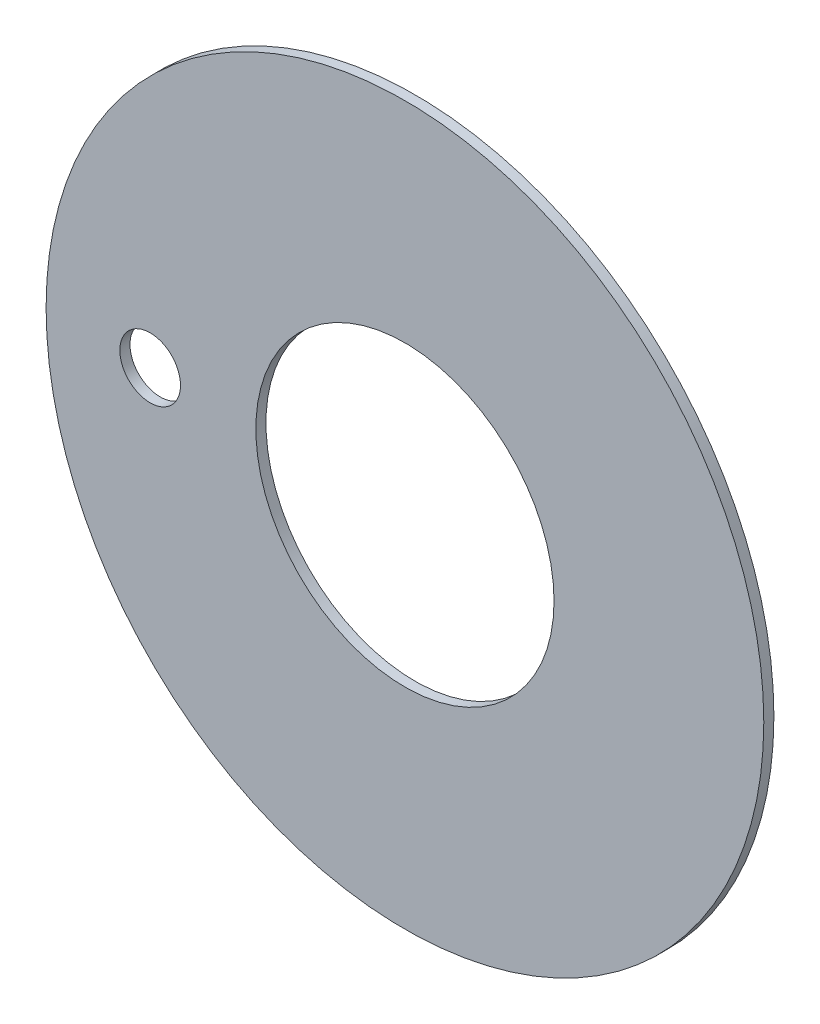
ISO-10303-21;
HEADER;
FILE_DESCRIPTION(('STEP AP214'),'2;1');
FILE_NAME('part.step','',(''),(''),'','','');
FILE_SCHEMA(('AUTOMOTIVE_DESIGN { 1 0 10303 214 1 1 1 1 }'));
ENDSEC;
DATA;
#1=APPLICATION_CONTEXT('core data for automotive mechanical design processes');
#2=APPLICATION_PROTOCOL_DEFINITION('international standard','automotive_design',2000,#1);
#3=PRODUCT_CONTEXT('',#1,'mechanical');
#4=PRODUCT('Part','Part','',(#3));
#5=PRODUCT_RELATED_PRODUCT_CATEGORY('part','',(#4));
#6=PRODUCT_DEFINITION_FORMATION('','',#4);
#7=PRODUCT_DEFINITION_CONTEXT('part definition',#1,'design');
#8=PRODUCT_DEFINITION('design','',#6,#7);
#9=PRODUCT_DEFINITION_SHAPE('','',#8);
#10=(LENGTH_UNIT() NAMED_UNIT(*) SI_UNIT(.MILLI.,.METRE.));
#11=(NAMED_UNIT(*) PLANE_ANGLE_UNIT() SI_UNIT($,.RADIAN.));
#12=(NAMED_UNIT(*) SI_UNIT($,.STERADIAN.) SOLID_ANGLE_UNIT());
#13=UNCERTAINTY_MEASURE_WITH_UNIT(LENGTH_MEASURE(1.E-05),#10,'distance_accuracy_value','');
#14=(GEOMETRIC_REPRESENTATION_CONTEXT(3) GLOBAL_UNCERTAINTY_ASSIGNED_CONTEXT((#13)) GLOBAL_UNIT_ASSIGNED_CONTEXT((#10,
#11,#12)) REPRESENTATION_CONTEXT('',''));
#15=CARTESIAN_POINT('',(0.,0.,0.));
#16=DIRECTION('',(0.,0.,1.));
#17=DIRECTION('',(1.,0.,0.));
#18=AXIS2_PLACEMENT_3D('',#15,#16,#17);
#19=CARTESIAN_POINT('',(0.,0.,1.));
#20=DIRECTION('',(0.,0.,-1.));
#21=DIRECTION('',(-1.,0.,0.));
#22=AXIS2_PLACEMENT_3D('',#19,#20,#21);
#23=CYLINDRICAL_SURFACE('',#22,35.5);
#24=CARTESIAN_POINT('',(0.,0.,1.));
#25=DIRECTION('',(0.,0.,1.));
#26=DIRECTION('',(1.,0.,0.));
#27=AXIS2_PLACEMENT_3D('',#24,#25,#26);
#28=CIRCLE('',#27,35.5);
#29=CARTESIAN_POINT('',(35.5,0.,1.));
#30=VERTEX_POINT('',#29);
#31=EDGE_CURVE('E10',#30,#30,#28,.T.);
#32=ORIENTED_EDGE('',*,*,#31,.F.);
#33=EDGE_LOOP('',(#32));
#34=FACE_BOUND('',#33,.T.);
#35=CARTESIAN_POINT('',(0.,0.,0.));
#36=DIRECTION('',(0.,0.,1.));
#37=DIRECTION('',(1.,0.,0.));
#38=AXIS2_PLACEMENT_3D('',#35,#36,#37);
#39=CIRCLE('',#38,35.5);
#40=CARTESIAN_POINT('',(35.5,0.,0.));
#41=VERTEX_POINT('',#40);
#42=EDGE_CURVE('E48',#41,#41,#39,.T.);
#43=ORIENTED_EDGE('',*,*,#42,.T.);
#44=EDGE_LOOP('',(#43));
#45=FACE_BOUND('',#44,.T.);
#46=ADVANCED_FACE('F44',(#34,#45),#23,.T.);
#47=CARTESIAN_POINT('',(0.,0.,1.));
#48=DIRECTION('',(0.,0.,1.));
#49=DIRECTION('',(1.,0.,0.));
#50=AXIS2_PLACEMENT_3D('',#47,#48,#49);
#51=PLANE('',#50);
#52=CARTESIAN_POINT('',(-25.2035737842538,0.,1.));
#53=DIRECTION('',(0.,0.,1.));
#54=DIRECTION('',(1.,0.,0.));
#55=AXIS2_PLACEMENT_3D('',#52,#53,#54);
#56=CIRCLE('',#55,3.);
#57=CARTESIAN_POINT('',(-22.2035737842538,0.,1.));
#58=VERTEX_POINT('',#57);
#59=EDGE_CURVE('E67',#58,#58,#56,.T.);
#60=ORIENTED_EDGE('',*,*,#59,.F.);
#61=EDGE_LOOP('',(#60));
#62=FACE_BOUND('',#61,.T.);
#63=CARTESIAN_POINT('',(0.,0.,1.));
#64=DIRECTION('',(0.,0.,1.));
#65=DIRECTION('',(1.,0.,0.));
#66=AXIS2_PLACEMENT_3D('',#63,#64,#65);
#67=CIRCLE('',#66,14.75);
#68=CARTESIAN_POINT('',(14.75,0.,1.));
#69=VERTEX_POINT('',#68);
#70=EDGE_CURVE('E61',#69,#69,#67,.T.);
#71=ORIENTED_EDGE('',*,*,#70,.F.);
#72=EDGE_LOOP('',(#71));
#73=FACE_BOUND('',#72,.T.);
#74=ORIENTED_EDGE('',*,*,#31,.T.);
#75=EDGE_LOOP('',(#74));
#76=FACE_BOUND('',#75,.T.);
#77=ADVANCED_FACE('F90',(#62,#73,#76),#51,.T.);
#78=CARTESIAN_POINT('',(0.,0.,0.));
#79=DIRECTION('',(0.,0.,1.));
#80=DIRECTION('',(1.,0.,0.));
#81=AXIS2_PLACEMENT_3D('',#78,#79,#80);
#82=PLANE('',#81);
#83=CARTESIAN_POINT('',(-25.2035737842538,0.,0.));
#84=DIRECTION('',(0.,0.,1.));
#85=DIRECTION('',(1.,0.,0.));
#86=AXIS2_PLACEMENT_3D('',#83,#84,#85);
#87=CIRCLE('',#86,3.);
#88=CARTESIAN_POINT('',(-22.2035737842538,0.,0.));
#89=VERTEX_POINT('',#88);
#90=EDGE_CURVE('E64',#89,#89,#87,.T.);
#91=ORIENTED_EDGE('',*,*,#90,.T.);
#92=EDGE_LOOP('',(#91));
#93=FACE_BOUND('',#92,.T.);
#94=CARTESIAN_POINT('',(0.,0.,0.));
#95=DIRECTION('',(0.,0.,1.));
#96=DIRECTION('',(1.,0.,0.));
#97=AXIS2_PLACEMENT_3D('',#94,#95,#96);
#98=CIRCLE('',#97,14.75);
#99=CARTESIAN_POINT('',(14.75,0.,0.));
#100=VERTEX_POINT('',#99);
#101=EDGE_CURVE('E56',#100,#100,#98,.T.);
#102=ORIENTED_EDGE('',*,*,#101,.T.);
#103=EDGE_LOOP('',(#102));
#104=FACE_BOUND('',#103,.T.);
#105=ORIENTED_EDGE('',*,*,#42,.F.);
#106=EDGE_LOOP('',(#105));
#107=FACE_BOUND('',#106,.T.);
#108=ADVANCED_FACE('F78',(#93,#104,#107),#82,.F.);
#109=CARTESIAN_POINT('',(0.,0.,0.));
#110=DIRECTION('',(0.,0.,1.));
#111=DIRECTION('',(1.,0.,0.));
#112=AXIS2_PLACEMENT_3D('',#109,#110,#111);
#113=CYLINDRICAL_SURFACE('',#112,14.75);
#114=ORIENTED_EDGE('',*,*,#101,.F.);
#115=EDGE_LOOP('',(#114));
#116=FACE_BOUND('',#115,.T.);
#117=ORIENTED_EDGE('',*,*,#70,.T.);
#118=EDGE_LOOP('',(#117));
#119=FACE_BOUND('',#118,.T.);
#120=ADVANCED_FACE('F84',(#116,#119),#113,.F.);
#121=CARTESIAN_POINT('',(-25.2035737842538,0.,0.));
#122=DIRECTION('',(0.,0.,1.));
#123=DIRECTION('',(1.,0.,0.));
#124=AXIS2_PLACEMENT_3D('',#121,#122,#123);
#125=CYLINDRICAL_SURFACE('',#124,3.);
#126=ORIENTED_EDGE('',*,*,#90,.F.);
#127=EDGE_LOOP('',(#126));
#128=FACE_BOUND('',#127,.T.);
#129=ORIENTED_EDGE('',*,*,#59,.T.);
#130=EDGE_LOOP('',(#129));
#131=FACE_BOUND('',#130,.T.);
#132=ADVANCED_FACE('F85',(#128,#131),#125,.F.);
#133=CLOSED_SHELL('',(#46,#77,#108,#120,#132));
#134=MANIFOLD_SOLID_BREP('B2',#133);
#135=ADVANCED_BREP_SHAPE_REPRESENTATION('',(#18,#134),#14);
#136=SHAPE_DEFINITION_REPRESENTATION(#9,#135);
ENDSEC;
END-ISO-10303-21;
